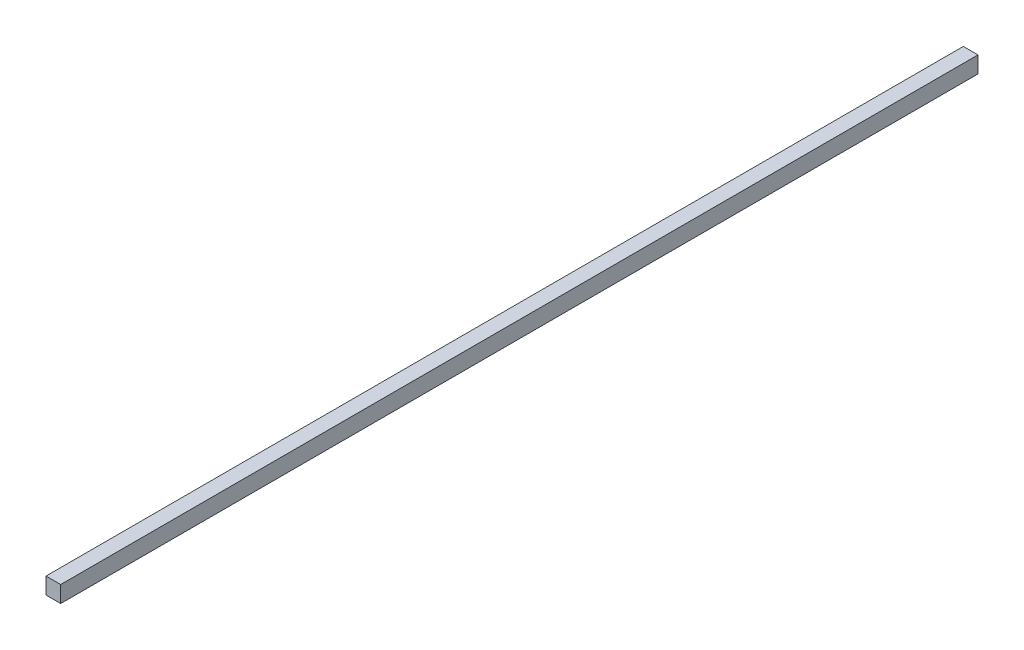
ISO-10303-21;
HEADER;
FILE_DESCRIPTION(('STEP AP214'),'2;1');
FILE_NAME('part.step','',(''),(''),'','','');
FILE_SCHEMA(('AUTOMOTIVE_DESIGN { 1 0 10303 214 1 1 1 1 }'));
ENDSEC;
DATA;
#1=APPLICATION_CONTEXT('core data for automotive mechanical design processes');
#2=APPLICATION_PROTOCOL_DEFINITION('international standard','automotive_design',2000,#1);
#3=PRODUCT_CONTEXT('',#1,'mechanical');
#4=PRODUCT('Part','Part','',(#3));
#5=PRODUCT_RELATED_PRODUCT_CATEGORY('part','',(#4));
#6=PRODUCT_DEFINITION_FORMATION('','',#4);
#7=PRODUCT_DEFINITION_CONTEXT('part definition',#1,'design');
#8=PRODUCT_DEFINITION('design','',#6,#7);
#9=PRODUCT_DEFINITION_SHAPE('','',#8);
#10=(LENGTH_UNIT() NAMED_UNIT(*) SI_UNIT(.MILLI.,.METRE.));
#11=(NAMED_UNIT(*) PLANE_ANGLE_UNIT() SI_UNIT($,.RADIAN.));
#12=(NAMED_UNIT(*) SI_UNIT($,.STERADIAN.) SOLID_ANGLE_UNIT());
#13=UNCERTAINTY_MEASURE_WITH_UNIT(LENGTH_MEASURE(1.E-05),#10,'distance_accuracy_value','');
#14=(GEOMETRIC_REPRESENTATION_CONTEXT(3) GLOBAL_UNCERTAINTY_ASSIGNED_CONTEXT((#13)) GLOBAL_UNIT_ASSIGNED_CONTEXT((#10,
#11,#12)) REPRESENTATION_CONTEXT('',''));
#15=CARTESIAN_POINT('',(0.,0.,0.));
#16=DIRECTION('',(0.,0.,1.));
#17=DIRECTION('',(1.,0.,0.));
#18=AXIS2_PLACEMENT_3D('',#15,#16,#17);
#19=CARTESIAN_POINT('',(0.,0.,25.0000008));
#20=DIRECTION('',(0.,0.,1.));
#21=DIRECTION('',(1.,0.,0.));
#22=AXIS2_PLACEMENT_3D('',#19,#20,#21);
#23=PLANE('',#22);
#24=DIRECTION('',(1.,0.,0.));
#25=VECTOR('',#24,1.);
#26=CARTESIAN_POINT('',(-0.1999996,-0.22500082,25.0000008));
#27=LINE('',#26,#25);
#28=CARTESIAN_POINT('',(-0.1999996,-0.22500082,25.0000008));
#29=VERTEX_POINT('',#28);
#30=CARTESIAN_POINT('',(0.1999996,-0.22500082,25.0000008));
#31=VERTEX_POINT('',#30);
#32=EDGE_CURVE('E94',#29,#31,#27,.T.);
#33=ORIENTED_EDGE('',*,*,#32,.T.);
#34=DIRECTION('',(0.,1.,0.));
#35=VECTOR('',#34,1.);
#36=CARTESIAN_POINT('',(0.1999996,-0.22500082,25.0000008));
#37=LINE('',#36,#35);
#38=CARTESIAN_POINT('',(0.1999996,0.22500082,25.0000008));
#39=VERTEX_POINT('',#38);
#40=EDGE_CURVE('E74',#31,#39,#37,.T.);
#41=ORIENTED_EDGE('',*,*,#40,.T.);
#42=DIRECTION('',(-1.,0.,0.));
#43=VECTOR('',#42,1.);
#44=CARTESIAN_POINT('',(0.1999996,0.22500082,25.0000008));
#45=LINE('',#44,#43);
#46=CARTESIAN_POINT('',(-0.1999996,0.22500082,25.0000008));
#47=VERTEX_POINT('',#46);
#48=EDGE_CURVE('E87',#39,#47,#45,.T.);
#49=ORIENTED_EDGE('',*,*,#48,.T.);
#50=DIRECTION('',(0.,-1.,0.));
#51=VECTOR('',#50,1.);
#52=CARTESIAN_POINT('',(-0.1999996,0.22500082,25.0000008));
#53=LINE('',#52,#51);
#54=EDGE_CURVE('E11',#47,#29,#53,.T.);
#55=ORIENTED_EDGE('',*,*,#54,.T.);
#56=EDGE_LOOP('',(#33,#41,#49,#55));
#57=FACE_BOUND('',#56,.T.);
#58=ADVANCED_FACE('F17',(#57),#23,.T.);
#59=CARTESIAN_POINT('',(0.,0.,0.));
#60=DIRECTION('',(0.,0.,1.));
#61=DIRECTION('',(1.,0.,0.));
#62=AXIS2_PLACEMENT_3D('',#59,#60,#61);
#63=PLANE('',#62);
#64=DIRECTION('',(0.,-1.,0.));
#65=VECTOR('',#64,1.);
#66=CARTESIAN_POINT('',(-0.1999996,0.22500082,0.));
#67=LINE('',#66,#65);
#68=CARTESIAN_POINT('',(-0.1999996,0.22500082,0.));
#69=VERTEX_POINT('',#68);
#70=CARTESIAN_POINT('',(-0.1999996,-0.22500082,0.));
#71=VERTEX_POINT('',#70);
#72=EDGE_CURVE('E26',#69,#71,#67,.T.);
#73=ORIENTED_EDGE('',*,*,#72,.F.);
#74=DIRECTION('',(-1.,0.,0.));
#75=VECTOR('',#74,1.);
#76=CARTESIAN_POINT('',(0.1999996,0.22500082,0.));
#77=LINE('',#76,#75);
#78=CARTESIAN_POINT('',(0.1999996,0.22500082,0.));
#79=VERTEX_POINT('',#78);
#80=EDGE_CURVE('E59',#79,#69,#77,.T.);
#81=ORIENTED_EDGE('',*,*,#80,.F.);
#82=DIRECTION('',(0.,1.,0.));
#83=VECTOR('',#82,1.);
#84=CARTESIAN_POINT('',(0.1999996,-0.22500082,0.));
#85=LINE('',#84,#83);
#86=CARTESIAN_POINT('',(0.1999996,-0.22500082,0.));
#87=VERTEX_POINT('',#86);
#88=EDGE_CURVE('E96',#87,#79,#85,.T.);
#89=ORIENTED_EDGE('',*,*,#88,.F.);
#90=DIRECTION('',(1.,0.,0.));
#91=VECTOR('',#90,1.);
#92=CARTESIAN_POINT('',(-0.1999996,-0.22500082,0.));
#93=LINE('',#92,#91);
#94=EDGE_CURVE('E93',#71,#87,#93,.T.);
#95=ORIENTED_EDGE('',*,*,#94,.F.);
#96=EDGE_LOOP('',(#73,#81,#89,#95));
#97=FACE_BOUND('',#96,.T.);
#98=ADVANCED_FACE('F98',(#97),#63,.F.);
#99=CARTESIAN_POINT('',(-0.1999996,0.22500082,0.));
#100=DIRECTION('',(1.,0.,0.));
#101=DIRECTION('',(0.,1.,0.));
#102=AXIS2_PLACEMENT_3D('',#99,#100,#101);
#103=PLANE('',#102);
#104=ORIENTED_EDGE('',*,*,#72,.T.);
#105=DIRECTION('',(0.,0.,1.));
#106=VECTOR('',#105,1.);
#107=CARTESIAN_POINT('',(-0.1999996,-0.22500082,0.));
#108=LINE('',#107,#106);
#109=EDGE_CURVE('E83',#71,#29,#108,.T.);
#110=ORIENTED_EDGE('',*,*,#109,.T.);
#111=ORIENTED_EDGE('',*,*,#54,.F.);
#112=DIRECTION('',(0.,0.,1.));
#113=VECTOR('',#112,1.);
#114=CARTESIAN_POINT('',(-0.1999996,0.22500082,0.));
#115=LINE('',#114,#113);
#116=EDGE_CURVE('E20',#69,#47,#115,.T.);
#117=ORIENTED_EDGE('',*,*,#116,.F.);
#118=EDGE_LOOP('',(#104,#110,#111,#117));
#119=FACE_BOUND('',#118,.T.);
#120=ADVANCED_FACE('F82',(#119),#103,.F.);
#121=CARTESIAN_POINT('',(0.1999996,0.22500082,0.));
#122=DIRECTION('',(0.,-1.,0.));
#123=DIRECTION('',(0.,0.,-1.));
#124=AXIS2_PLACEMENT_3D('',#121,#122,#123);
#125=PLANE('',#124);
#126=ORIENTED_EDGE('',*,*,#80,.T.);
#127=ORIENTED_EDGE('',*,*,#116,.T.);
#128=ORIENTED_EDGE('',*,*,#48,.F.);
#129=DIRECTION('',(0.,0.,1.));
#130=VECTOR('',#129,1.);
#131=CARTESIAN_POINT('',(0.1999996,0.22500082,0.));
#132=LINE('',#131,#130);
#133=EDGE_CURVE('E110',#79,#39,#132,.T.);
#134=ORIENTED_EDGE('',*,*,#133,.F.);
#135=EDGE_LOOP('',(#126,#127,#128,#134));
#136=FACE_BOUND('',#135,.T.);
#137=ADVANCED_FACE('F126',(#136),#125,.F.);
#138=CARTESIAN_POINT('',(0.1999996,-0.22500082,0.));
#139=DIRECTION('',(-1.,0.,0.));
#140=DIRECTION('',(0.,0.,1.));
#141=AXIS2_PLACEMENT_3D('',#138,#139,#140);
#142=PLANE('',#141);
#143=ORIENTED_EDGE('',*,*,#88,.T.);
#144=ORIENTED_EDGE('',*,*,#133,.T.);
#145=ORIENTED_EDGE('',*,*,#40,.F.);
#146=DIRECTION('',(0.,0.,1.));
#147=VECTOR('',#146,1.);
#148=CARTESIAN_POINT('',(0.1999996,-0.22500082,0.));
#149=LINE('',#148,#147);
#150=EDGE_CURVE('E101',#87,#31,#149,.T.);
#151=ORIENTED_EDGE('',*,*,#150,.F.);
#152=EDGE_LOOP('',(#143,#144,#145,#151));
#153=FACE_BOUND('',#152,.T.);
#154=ADVANCED_FACE('F127',(#153),#142,.F.);
#155=CARTESIAN_POINT('',(-0.1999996,-0.22500082,0.));
#156=DIRECTION('',(0.,1.,0.));
#157=DIRECTION('',(1.,0.,0.));
#158=AXIS2_PLACEMENT_3D('',#155,#156,#157);
#159=PLANE('',#158);
#160=ORIENTED_EDGE('',*,*,#94,.T.);
#161=ORIENTED_EDGE('',*,*,#150,.T.);
#162=ORIENTED_EDGE('',*,*,#32,.F.);
#163=ORIENTED_EDGE('',*,*,#109,.F.);
#164=EDGE_LOOP('',(#160,#161,#162,#163));
#165=FACE_BOUND('',#164,.T.);
#166=ADVANCED_FACE('F91',(#165),#159,.F.);
#167=CLOSED_SHELL('',(#58,#98,#120,#137,#154,#166));
#168=MANIFOLD_SOLID_BREP('B1',#167);
#169=ADVANCED_BREP_SHAPE_REPRESENTATION('',(#18,#168),#14);
#170=SHAPE_DEFINITION_REPRESENTATION(#9,#169);
ENDSEC;
END-ISO-10303-21;
